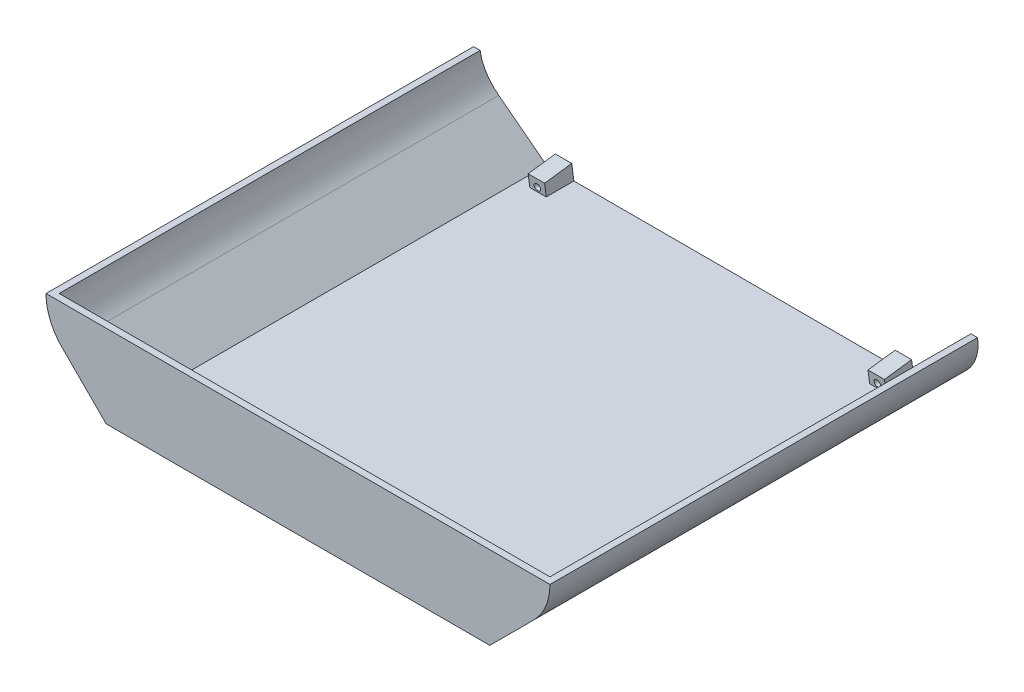
ISO-10303-21;
HEADER;
FILE_DESCRIPTION(('STEP AP214'),'2;1');
FILE_NAME('part.step','',(''),(''),'','','');
FILE_SCHEMA(('AUTOMOTIVE_DESIGN { 1 0 10303 214 1 1 1 1 }'));
ENDSEC;
DATA;
#1=APPLICATION_CONTEXT('core data for automotive mechanical design processes');
#2=APPLICATION_PROTOCOL_DEFINITION('international standard','automotive_design',2000,#1);
#3=PRODUCT_CONTEXT('',#1,'mechanical');
#4=PRODUCT('Part','Part','',(#3));
#5=PRODUCT_RELATED_PRODUCT_CATEGORY('part','',(#4));
#6=PRODUCT_DEFINITION_FORMATION('','',#4);
#7=PRODUCT_DEFINITION_CONTEXT('part definition',#1,'design');
#8=PRODUCT_DEFINITION('design','',#6,#7);
#9=PRODUCT_DEFINITION_SHAPE('','',#8);
#10=(LENGTH_UNIT() NAMED_UNIT(*) SI_UNIT(.MILLI.,.METRE.));
#11=(NAMED_UNIT(*) PLANE_ANGLE_UNIT() SI_UNIT($,.RADIAN.));
#12=(NAMED_UNIT(*) SI_UNIT($,.STERADIAN.) SOLID_ANGLE_UNIT());
#13=UNCERTAINTY_MEASURE_WITH_UNIT(LENGTH_MEASURE(1.E-05),#10,'distance_accuracy_value','');
#14=(GEOMETRIC_REPRESENTATION_CONTEXT(3) GLOBAL_UNCERTAINTY_ASSIGNED_CONTEXT((#13)) GLOBAL_UNIT_ASSIGNED_CONTEXT((#10,
#11,#12)) REPRESENTATION_CONTEXT('',''));
#15=CARTESIAN_POINT('',(0.,0.,0.));
#16=DIRECTION('',(0.,0.,1.));
#17=DIRECTION('',(1.,0.,0.));
#18=AXIS2_PLACEMENT_3D('',#15,#16,#17);
#19=CARTESIAN_POINT('',(-175.,6.,400.));
#20=DIRECTION('',(0.,1.,0.));
#21=DIRECTION('',(-1.,0.,0.));
#22=AXIS2_PLACEMENT_3D('',#19,#20,#21);
#23=PLANE('',#22);
#24=DIRECTION('',(1.,0.,0.));
#25=VECTOR('',#24,1.);
#26=CARTESIAN_POINT('',(0.,6.,0.789914985524294));
#27=LINE('',#26,#25);
#28=CARTESIAN_POINT('',(162.514718625761,6.,0.789914985524294));
#29=VERTEX_POINT('',#28);
#30=CARTESIAN_POINT('',(172.514718625761,6.,0.789914985524294));
#31=VERTEX_POINT('',#30);
#32=EDGE_CURVE('E208',#29,#31,#27,.T.);
#33=ORIENTED_EDGE('',*,*,#32,.F.);
#34=DIRECTION('',(0.,0.,1.));
#35=VECTOR('',#34,1.);
#36=CARTESIAN_POINT('',(162.514718625762,6.,400.));
#37=LINE('',#36,#35);
#38=CARTESIAN_POINT('',(162.514718625761,6.,26.0056390000281));
#39=VERTEX_POINT('',#38);
#40=EDGE_CURVE('E202',#29,#39,#37,.T.);
#41=ORIENTED_EDGE('',*,*,#40,.T.);
#42=DIRECTION('',(1.,0.,0.));
#43=VECTOR('',#42,1.);
#44=CARTESIAN_POINT('',(-175.,6.,26.0056390000281));
#45=LINE('',#44,#43);
#46=CARTESIAN_POINT('',(147.514718625761,6.,26.0056390000281));
#47=VERTEX_POINT('',#46);
#48=EDGE_CURVE('E11',#47,#39,#45,.T.);
#49=ORIENTED_EDGE('',*,*,#48,.F.);
#50=DIRECTION('',(0.,0.,-1.));
#51=VECTOR('',#50,1.);
#52=CARTESIAN_POINT('',(147.514718625761,6.,400.));
#53=LINE('',#52,#51);
#54=CARTESIAN_POINT('',(147.514718625761,6.00000000000006,0.789914985524302));
#55=VERTEX_POINT('',#54);
#56=EDGE_CURVE('E186',#47,#55,#53,.T.);
#57=ORIENTED_EDGE('',*,*,#56,.T.);
#58=CARTESIAN_POINT('',(-147.514718625761,6.,0.789914985524294));
#59=VERTEX_POINT('',#58);
#60=EDGE_CURVE('E199',#59,#55,#27,.T.);
#61=ORIENTED_EDGE('',*,*,#60,.F.);
#62=DIRECTION('',(0.,0.,1.));
#63=VECTOR('',#62,1.);
#64=CARTESIAN_POINT('',(-147.514718625761,6.,400.));
#65=LINE('',#64,#63);
#66=CARTESIAN_POINT('',(-147.514718625761,6.,26.0056390000281));
#67=VERTEX_POINT('',#66);
#68=EDGE_CURVE('E54',#59,#67,#65,.T.);
#69=ORIENTED_EDGE('',*,*,#68,.T.);
#70=DIRECTION('',(-1.,0.,0.));
#71=VECTOR('',#70,1.);
#72=CARTESIAN_POINT('',(-175.,6.,26.0056390000281));
#73=LINE('',#72,#71);
#74=CARTESIAN_POINT('',(-162.514718625761,6.,26.0056390000281));
#75=VERTEX_POINT('',#74);
#76=EDGE_CURVE('E310',#67,#75,#73,.T.);
#77=ORIENTED_EDGE('',*,*,#76,.T.);
#78=DIRECTION('',(0.,0.,-1.));
#79=VECTOR('',#78,1.);
#80=CARTESIAN_POINT('',(-162.514718625762,6.,400.));
#81=LINE('',#80,#79);
#82=CARTESIAN_POINT('',(-162.514718625761,6.,0.789914985524294));
#83=VERTEX_POINT('',#82);
#84=EDGE_CURVE('E314',#75,#83,#81,.T.);
#85=ORIENTED_EDGE('',*,*,#84,.T.);
#86=CARTESIAN_POINT('',(-172.514718625761,6.,0.789914985524294));
#87=VERTEX_POINT('',#86);
#88=EDGE_CURVE('E207',#87,#83,#27,.T.);
#89=ORIENTED_EDGE('',*,*,#88,.F.);
#90=DIRECTION('',(0.,0.,-1.));
#91=VECTOR('',#90,1.);
#92=CARTESIAN_POINT('',(-172.514718625761,6.,400.));
#93=LINE('',#92,#91);
#94=CARTESIAN_POINT('',(-172.514718625761,6.,394.));
#95=VERTEX_POINT('',#94);
#96=EDGE_CURVE('E365',#95,#87,#93,.T.);
#97=ORIENTED_EDGE('',*,*,#96,.F.);
#98=DIRECTION('',(1.,0.,0.));
#99=VECTOR('',#98,1.);
#100=CARTESIAN_POINT('',(-175.,6.,394.));
#101=LINE('',#100,#99);
#102=CARTESIAN_POINT('',(172.514718625761,6.,394.));
#103=VERTEX_POINT('',#102);
#104=EDGE_CURVE('E366',#95,#103,#101,.T.);
#105=ORIENTED_EDGE('',*,*,#104,.T.);
#106=DIRECTION('',(0.,0.,-1.));
#107=VECTOR('',#106,1.);
#108=CARTESIAN_POINT('',(172.514718625761,6.,400.));
#109=LINE('',#108,#107);
#110=EDGE_CURVE('E361',#103,#31,#109,.T.);
#111=ORIENTED_EDGE('',*,*,#110,.T.);
#112=EDGE_LOOP('',(#33,#41,#49,#57,#61,#69,#77,#85,#89,#97,#105,#111));
#113=FACE_BOUND('',#112,.T.);
#114=ADVANCED_FACE('F45',(#113),#23,.T.);
#115=CARTESIAN_POINT('',(175.,0.,400.));
#116=DIRECTION('',(-0.707106781186546,0.707106781186549,0.));
#117=DIRECTION('',(-0.707106781186549,-0.707106781186546,0.));
#118=AXIS2_PLACEMENT_3D('',#115,#116,#117);
#119=PLANE('',#118);
#120=DIRECTION('',(-0.704062592219638,-0.704062592219636,-0.0926915987235618));
#121=VECTOR('',#120,1.);
#122=CARTESIAN_POINT('',(201.104274909717,26.1042749097173,3.43669298957194));
#123=LINE('',#122,#121);
#124=CARTESIAN_POINT('',(215.218833806895,40.2188338068951,5.29490992072962));
#125=VERTEX_POINT('',#124);
#126=CARTESIAN_POINT('',(175.,0.,0.));
#127=VERTEX_POINT('',#126);
#128=EDGE_CURVE('E263',#125,#127,#123,.T.);
#129=ORIENTED_EDGE('',*,*,#128,.F.);
#130=DIRECTION('',(0.,0.,-1.));
#131=VECTOR('',#130,1.);
#132=CARTESIAN_POINT('',(215.218833806895,40.2188338068951,400.));
#133=LINE('',#132,#131);
#134=CARTESIAN_POINT('',(215.218833806895,40.2188338068951,400.));
#135=VERTEX_POINT('',#134);
#136=EDGE_CURVE('E306',#135,#125,#133,.T.);
#137=ORIENTED_EDGE('',*,*,#136,.F.);
#138=DIRECTION('',(0.707106781186549,0.707106781186546,0.));
#139=VECTOR('',#138,1.);
#140=CARTESIAN_POINT('',(175.,0.,400.));
#141=LINE('',#140,#139);
#142=CARTESIAN_POINT('',(175.,0.,400.));
#143=VERTEX_POINT('',#142);
#144=EDGE_CURVE('E267',#143,#135,#141,.T.);
#145=ORIENTED_EDGE('',*,*,#144,.F.);
#146=DIRECTION('',(0.,0.,-1.));
#147=VECTOR('',#146,1.);
#148=CARTESIAN_POINT('',(175.,0.,400.));
#149=LINE('',#148,#147);
#150=EDGE_CURVE('E284',#143,#127,#149,.T.);
#151=ORIENTED_EDGE('',*,*,#150,.T.);
#152=EDGE_LOOP('',(#129,#137,#145,#151));
#153=FACE_BOUND('',#152,.T.);
#154=ADVANCED_FACE('F47',(#153),#119,.F.);
#155=CARTESIAN_POINT('',(179.863494747568,75.5741728662225,400.));
#156=DIRECTION('',(0.,0.,-1.));
#157=DIRECTION('',(-1.,0.,0.));
#158=AXIS2_PLACEMENT_3D('',#155,#156,#157);
#159=CYLINDRICAL_SURFACE('',#158,50.);
#160=CARTESIAN_POINT('',(179.863494747568,75.5741728662225,9.94952861093878));
#161=DIRECTION('',(0.,0.130526192220038,-0.991444861373812));
#162=DIRECTION('',(0.,-0.991444861373812,-0.130526192220038));
#163=AXIS2_PLACEMENT_3D('',#160,#161,#162);
#164=ELLIPSE('',#163,50.4314480290075,50.);
#165=CARTESIAN_POINT('',(229.863494747568,75.5741721608928,9.94952851808034));
#166=VERTEX_POINT('',#165);
#167=EDGE_CURVE('E260',#166,#125,#164,.T.);
#168=ORIENTED_EDGE('',*,*,#167,.F.);
#169=DIRECTION('',(0.,0.,-1.));
#170=VECTOR('',#169,1.);
#171=CARTESIAN_POINT('',(229.863494747568,75.5741720841793,400.));
#172=LINE('',#171,#170);
#173=CARTESIAN_POINT('',(229.863494747568,75.5741720841793,400.));
#174=VERTEX_POINT('',#173);
#175=EDGE_CURVE('E303',#174,#166,#172,.T.);
#176=ORIENTED_EDGE('',*,*,#175,.F.);
#177=CARTESIAN_POINT('',(179.863494747568,75.5741728662225,400.));
#178=DIRECTION('',(0.,0.,1.));
#179=DIRECTION('',(1.,0.,0.));
#180=AXIS2_PLACEMENT_3D('',#177,#178,#179);
#181=CIRCLE('',#180,50.);
#182=EDGE_CURVE('E271',#135,#174,#181,.T.);
#183=ORIENTED_EDGE('',*,*,#182,.F.);
#184=ORIENTED_EDGE('',*,*,#136,.T.);
#185=EDGE_LOOP('',(#168,#176,#183,#184));
#186=FACE_BOUND('',#185,.T.);
#187=ADVANCED_FACE('F427',(#186),#159,.T.);
#188=CARTESIAN_POINT('',(-179.863494747568,75.5741728662222,400.));
#189=DIRECTION('',(0.,0.,-1.));
#190=DIRECTION('',(-1.,0.,0.));
#191=AXIS2_PLACEMENT_3D('',#188,#189,#190);
#192=CYLINDRICAL_SURFACE('',#191,50.);
#193=CARTESIAN_POINT('',(-179.863494747568,75.5741728662222,9.94952861093873));
#194=DIRECTION('',(0.,0.130526192220038,-0.991444861373812));
#195=DIRECTION('',(0.,-0.991444861373812,-0.130526192220038));
#196=AXIS2_PLACEMENT_3D('',#193,#194,#195);
#197=ELLIPSE('',#196,50.4314480290075,50.);
#198=CARTESIAN_POINT('',(-215.218833806895,40.2188338068946,5.29490992072952));
#199=VERTEX_POINT('',#198);
#200=CARTESIAN_POINT('',(-229.863494747568,75.5741721608927,9.94952851808034));
#201=VERTEX_POINT('',#200);
#202=EDGE_CURVE('E256',#199,#201,#197,.T.);
#203=ORIENTED_EDGE('',*,*,#202,.F.);
#204=DIRECTION('',(0.,0.,-1.));
#205=VECTOR('',#204,1.);
#206=CARTESIAN_POINT('',(-215.218833806895,40.2188338068946,400.));
#207=LINE('',#206,#205);
#208=CARTESIAN_POINT('',(-215.218833806895,40.2188338068946,400.));
#209=VERTEX_POINT('',#208);
#210=EDGE_CURVE('E295',#209,#199,#207,.T.);
#211=ORIENTED_EDGE('',*,*,#210,.F.);
#212=CARTESIAN_POINT('',(-179.863494747568,75.5741728662222,400.));
#213=DIRECTION('',(0.,0.,1.));
#214=DIRECTION('',(-1.,0.,0.));
#215=AXIS2_PLACEMENT_3D('',#212,#213,#214);
#216=CIRCLE('',#215,50.);
#217=CARTESIAN_POINT('',(-229.863494747568,75.5741720841793,400.));
#218=VERTEX_POINT('',#217);
#219=EDGE_CURVE('E275',#218,#209,#216,.T.);
#220=ORIENTED_EDGE('',*,*,#219,.F.);
#221=DIRECTION('',(0.,0.,-1.));
#222=VECTOR('',#221,1.);
#223=CARTESIAN_POINT('',(-229.863494747568,75.5741720841793,400.));
#224=LINE('',#223,#222);
#225=EDGE_CURVE('E299',#218,#201,#224,.T.);
#226=ORIENTED_EDGE('',*,*,#225,.T.);
#227=EDGE_LOOP('',(#203,#211,#220,#226));
#228=FACE_BOUND('',#227,.T.);
#229=ADVANCED_FACE('F419',(#228),#192,.T.);
#230=CARTESIAN_POINT('',(-175.,0.,400.));
#231=DIRECTION('',(0.707106781186543,0.707106781186552,0.));
#232=DIRECTION('',(-0.707106781186552,0.707106781186543,0.));
#233=AXIS2_PLACEMENT_3D('',#230,#231,#232);
#234=PLANE('',#233);
#235=DIRECTION('',(-0.704062592219641,0.704062592219633,0.0926915987235614));
#236=VECTOR('',#235,1.);
#237=CARTESIAN_POINT('',(-201.104274909717,26.1042749097171,3.43669298957189));
#238=LINE('',#237,#236);
#239=CARTESIAN_POINT('',(-175.,0.,0.));
#240=VERTEX_POINT('',#239);
#241=EDGE_CURVE('E253',#240,#199,#238,.T.);
#242=ORIENTED_EDGE('',*,*,#241,.F.);
#243=DIRECTION('',(0.,0.,-1.));
#244=VECTOR('',#243,1.);
#245=CARTESIAN_POINT('',(-175.,0.,400.));
#246=LINE('',#245,#244);
#247=CARTESIAN_POINT('',(-175.,0.,400.));
#248=VERTEX_POINT('',#247);
#249=EDGE_CURVE('E291',#248,#240,#246,.T.);
#250=ORIENTED_EDGE('',*,*,#249,.F.);
#251=DIRECTION('',(0.707106781186552,-0.707106781186543,0.));
#252=VECTOR('',#251,1.);
#253=CARTESIAN_POINT('',(-175.,0.,400.));
#254=LINE('',#253,#252);
#255=EDGE_CURVE('E278',#209,#248,#254,.T.);
#256=ORIENTED_EDGE('',*,*,#255,.F.);
#257=ORIENTED_EDGE('',*,*,#210,.T.);
#258=EDGE_LOOP('',(#242,#250,#256,#257));
#259=FACE_BOUND('',#258,.T.);
#260=ADVANCED_FACE('F435',(#259),#234,.F.);
#261=CARTESIAN_POINT('',(-175.,0.,400.));
#262=DIRECTION('',(0.,1.,0.));
#263=DIRECTION('',(-1.,0.,0.));
#264=AXIS2_PLACEMENT_3D('',#261,#262,#263);
#265=PLANE('',#264);
#266=DIRECTION('',(1.,0.,0.));
#267=VECTOR('',#266,1.);
#268=CARTESIAN_POINT('',(-175.,0.,0.));
#269=LINE('',#268,#267);
#270=EDGE_CURVE('E266',#240,#127,#269,.T.);
#271=ORIENTED_EDGE('',*,*,#270,.T.);
#272=ORIENTED_EDGE('',*,*,#150,.F.);
#273=DIRECTION('',(1.,0.,0.));
#274=VECTOR('',#273,1.);
#275=CARTESIAN_POINT('',(-175.,0.,400.));
#276=LINE('',#275,#274);
#277=EDGE_CURVE('E281',#248,#143,#276,.T.);
#278=ORIENTED_EDGE('',*,*,#277,.F.);
#279=ORIENTED_EDGE('',*,*,#249,.T.);
#280=EDGE_LOOP('',(#271,#272,#278,#279));
#281=FACE_BOUND('',#280,.T.);
#282=ADVANCED_FACE('F433',(#281),#265,.F.);
#283=CARTESIAN_POINT('',(179.863494747568,75.5741728662225,400.));
#284=DIRECTION('',(0.,0.,1.));
#285=DIRECTION('',(1.,0.,0.));
#286=AXIS2_PLACEMENT_3D('',#283,#284,#285);
#287=PLANE('',#286);
#288=DIRECTION('',(1.,0.,0.));
#289=VECTOR('',#288,1.);
#290=CARTESIAN_POINT('',(-310.,75.5741720841793,400.));
#291=LINE('',#290,#289);
#292=EDGE_CURVE('E250',#218,#174,#291,.T.);
#293=ORIENTED_EDGE('',*,*,#292,.F.);
#294=ORIENTED_EDGE('',*,*,#219,.T.);
#295=ORIENTED_EDGE('',*,*,#255,.T.);
#296=ORIENTED_EDGE('',*,*,#277,.T.);
#297=ORIENTED_EDGE('',*,*,#144,.T.);
#298=ORIENTED_EDGE('',*,*,#182,.T.);
#299=EDGE_LOOP('',(#293,#294,#295,#296,#297,#298));
#300=FACE_BOUND('',#299,.T.);
#301=ADVANCED_FACE('F422',(#300),#287,.T.);
#302=CARTESIAN_POINT('',(0.,0.,0.));
#303=DIRECTION('',(0.,0.130526192220038,-0.991444861373812));
#304=DIRECTION('',(0.,0.991444861373812,0.130526192220038));
#305=AXIS2_PLACEMENT_3D('',#302,#303,#304);
#306=PLANE('',#305);
#307=CARTESIAN_POINT('',(155.014718625761,13.4358364603037,1.76886142717459));
#308=DIRECTION('',(0.,0.130526192220038,-0.991444861373812));
#309=DIRECTION('',(0.,0.991444861373812,0.130526192220038));
#310=AXIS2_PLACEMENT_3D('',#307,#308,#309);
#311=CIRCLE('',#310,2.99999999999999);
#312=CARTESIAN_POINT('',(155.014718625761,16.4101710444251,2.16044000383471));
#313=VERTEX_POINT('',#312);
#314=EDGE_CURVE('E705',#313,#313,#311,.T.);
#315=ORIENTED_EDGE('',*,*,#314,.F.);
#316=EDGE_LOOP('',(#315));
#317=FACE_BOUND('',#316,.T.);
#318=CARTESIAN_POINT('',(-155.014718625761,13.4358364603036,1.76886142717459));
#319=DIRECTION('',(0.,0.130526192220038,-0.991444861373812));
#320=DIRECTION('',(0.,-0.991444861373812,-0.130526192220038));
#321=AXIS2_PLACEMENT_3D('',#318,#319,#320);
#322=CIRCLE('',#321,2.99999999999999);
#323=CARTESIAN_POINT('',(-155.014718625761,10.4615018761822,1.37728285051447));
#324=VERTEX_POINT('',#323);
#325=EDGE_CURVE('E700',#324,#324,#322,.T.);
#326=ORIENTED_EDGE('',*,*,#325,.F.);
#327=EDGE_LOOP('',(#326));
#328=FACE_BOUND('',#327,.T.);
#329=DIRECTION('',(-1.,0.,0.));
#330=VECTOR('',#329,1.);
#331=CARTESIAN_POINT('',(0.,75.5741721608927,9.94952851808035));
#332=LINE('',#331,#330);
#333=CARTESIAN_POINT('',(223.863494747568,75.5741721608927,9.94952851808037));
#334=VERTEX_POINT('',#333);
#335=EDGE_CURVE('E232',#166,#334,#332,.T.);
#336=ORIENTED_EDGE('',*,*,#335,.F.);
#337=ORIENTED_EDGE('',*,*,#167,.T.);
#338=ORIENTED_EDGE('',*,*,#128,.T.);
#339=ORIENTED_EDGE('',*,*,#270,.F.);
#340=ORIENTED_EDGE('',*,*,#241,.T.);
#341=ORIENTED_EDGE('',*,*,#202,.T.);
#342=CARTESIAN_POINT('',(-223.863494747568,75.5741721608927,9.94952851808034));
#343=VERTEX_POINT('',#342);
#344=EDGE_CURVE('E352',#343,#201,#332,.T.);
#345=ORIENTED_EDGE('',*,*,#344,.F.);
#346=CARTESIAN_POINT('',(-179.863494747568,75.5741728662222,9.94952861093873));
#347=DIRECTION('',(0.,0.130526192220038,-0.991444861373812));
#348=DIRECTION('',(0.,-0.991444861373812,-0.130526192220038));
#349=AXIS2_PLACEMENT_3D('',#346,#347,#348);
#350=ELLIPSE('',#349,44.3796742655266,44.);
#351=CARTESIAN_POINT('',(-210.976193119776,44.4614744940139,5.85346416355459));
#352=VERTEX_POINT('',#351);
#353=EDGE_CURVE('E221',#352,#343,#350,.T.);
#354=ORIENTED_EDGE('',*,*,#353,.F.);
#355=DIRECTION('',(-0.704062592219641,0.704062592219633,0.0926915987235614));
#356=VECTOR('',#355,1.);
#357=CARTESIAN_POINT('',(-196.825182588831,30.3104639630696,3.99044828377049));
#358=LINE('',#357,#356);
#359=EDGE_CURVE('E218',#87,#352,#358,.T.);
#360=ORIENTED_EDGE('',*,*,#359,.F.);
#361=ORIENTED_EDGE('',*,*,#88,.T.);
#362=DIRECTION('',(0.,-0.991444861373812,-0.130526192220038));
#363=VECTOR('',#362,1.);
#364=CARTESIAN_POINT('',(-162.514718625761,6.,0.789914985524294));
#365=LINE('',#364,#363);
#366=CARTESIAN_POINT('',(-162.514718625761,20.8716729206072,2.74780786882487));
#367=VERTEX_POINT('',#366);
#368=EDGE_CURVE('E329',#367,#83,#365,.T.);
#369=ORIENTED_EDGE('',*,*,#368,.F.);
#370=DIRECTION('',(-1.,0.,0.));
#371=VECTOR('',#370,1.);
#372=CARTESIAN_POINT('',(-162.514718625761,20.8716729206072,2.74780786882487));
#373=LINE('',#372,#371);
#374=CARTESIAN_POINT('',(-147.514718625761,20.8716729206072,2.74780786882487));
#375=VERTEX_POINT('',#374);
#376=EDGE_CURVE('E335',#375,#367,#373,.T.);
#377=ORIENTED_EDGE('',*,*,#376,.F.);
#378=DIRECTION('',(0.,0.991444861373812,0.130526192220038));
#379=VECTOR('',#378,1.);
#380=CARTESIAN_POINT('',(-147.514718625761,20.8716729206072,2.74780786882487));
#381=LINE('',#380,#379);
#382=EDGE_CURVE('E68',#59,#375,#381,.T.);
#383=ORIENTED_EDGE('',*,*,#382,.F.);
#384=ORIENTED_EDGE('',*,*,#60,.T.);
#385=DIRECTION('',(0.,-0.991444861373812,-0.130526192220038));
#386=VECTOR('',#385,1.);
#387=CARTESIAN_POINT('',(147.514718625761,20.8716729206072,2.74780786882488));
#388=LINE('',#387,#386);
#389=CARTESIAN_POINT('',(147.514718625761,20.8716729206072,2.74780786882488));
#390=VERTEX_POINT('',#389);
#391=EDGE_CURVE('E182',#390,#55,#388,.T.);
#392=ORIENTED_EDGE('',*,*,#391,.F.);
#393=DIRECTION('',(-1.,0.,0.));
#394=VECTOR('',#393,1.);
#395=CARTESIAN_POINT('',(162.514718625762,20.8716729206072,2.74780786882488));
#396=LINE('',#395,#394);
#397=CARTESIAN_POINT('',(162.514718625762,20.8716729206072,2.74780786882488));
#398=VERTEX_POINT('',#397);
#399=EDGE_CURVE('E191',#398,#390,#396,.T.);
#400=ORIENTED_EDGE('',*,*,#399,.F.);
#401=DIRECTION('',(0.,0.991444861373812,0.130526192220038));
#402=VECTOR('',#401,1.);
#403=CARTESIAN_POINT('',(162.514718625761,6.00000000000005,0.789914985524301));
#404=LINE('',#403,#402);
#405=EDGE_CURVE('E61',#29,#398,#404,.T.);
#406=ORIENTED_EDGE('',*,*,#405,.F.);
#407=ORIENTED_EDGE('',*,*,#32,.T.);
#408=DIRECTION('',(-0.704062592219638,-0.704062592219636,-0.0926915987235618));
#409=VECTOR('',#408,1.);
#410=CARTESIAN_POINT('',(196.825182588831,30.3104639630699,3.99044828377049));
#411=LINE('',#410,#409);
#412=CARTESIAN_POINT('',(210.976193119776,44.4614744940144,5.85346416355464));
#413=VERTEX_POINT('',#412);
#414=EDGE_CURVE('E214',#413,#31,#411,.T.);
#415=ORIENTED_EDGE('',*,*,#414,.F.);
#416=CARTESIAN_POINT('',(179.863494747568,75.5741728662225,9.94952861093878));
#417=DIRECTION('',(0.,0.130526192220038,-0.991444861373812));
#418=DIRECTION('',(0.,-0.991444861373812,-0.130526192220038));
#419=AXIS2_PLACEMENT_3D('',#416,#417,#418);
#420=ELLIPSE('',#419,44.3796742655266,44.);
#421=EDGE_CURVE('E226',#334,#413,#420,.T.);
#422=ORIENTED_EDGE('',*,*,#421,.F.);
#423=EDGE_LOOP('',(#336,#337,#338,#339,#340,#341,#345,#354,#360,#361,#369,#377,#383,#384,#392,
#400,#406,#407,#415,#422));
#424=FACE_BOUND('',#423,.T.);
#425=ADVANCED_FACE('F205',(#317,#328,#424),#306,.T.);
#426=CARTESIAN_POINT('',(170.757359312881,4.24264068711929,400.));
#427=DIRECTION('',(-0.707106781186546,0.707106781186549,0.));
#428=DIRECTION('',(-0.707106781186549,-0.707106781186546,0.));
#429=AXIS2_PLACEMENT_3D('',#426,#427,#428);
#430=PLANE('',#429);
#431=ORIENTED_EDGE('',*,*,#414,.T.);
#432=ORIENTED_EDGE('',*,*,#110,.F.);
#433=DIRECTION('',(0.707106781186549,0.707106781186546,0.));
#434=VECTOR('',#433,1.);
#435=CARTESIAN_POINT('',(170.757359312881,4.24264068711929,394.));
#436=LINE('',#435,#434);
#437=CARTESIAN_POINT('',(210.976193119776,44.4614744940144,394.));
#438=VERTEX_POINT('',#437);
#439=EDGE_CURVE('E213',#103,#438,#436,.T.);
#440=ORIENTED_EDGE('',*,*,#439,.T.);
#441=DIRECTION('',(0.,0.,-1.));
#442=VECTOR('',#441,1.);
#443=CARTESIAN_POINT('',(210.976193119776,44.4614744940144,400.));
#444=LINE('',#443,#442);
#445=EDGE_CURVE('E246',#438,#413,#444,.T.);
#446=ORIENTED_EDGE('',*,*,#445,.T.);
#447=EDGE_LOOP('',(#431,#432,#440,#446));
#448=FACE_BOUND('',#447,.T.);
#449=ADVANCED_FACE('F401',(#448),#430,.T.);
#450=CARTESIAN_POINT('',(179.863494747568,75.5741728662225,400.));
#451=DIRECTION('',(0.,0.,-1.));
#452=DIRECTION('',(-1.,0.,0.));
#453=AXIS2_PLACEMENT_3D('',#450,#451,#452);
#454=CYLINDRICAL_SURFACE('',#453,44.);
#455=ORIENTED_EDGE('',*,*,#421,.T.);
#456=ORIENTED_EDGE('',*,*,#445,.F.);
#457=CARTESIAN_POINT('',(179.863494747568,75.5741728662225,394.));
#458=DIRECTION('',(0.,0.,1.));
#459=DIRECTION('',(1.,0.,0.));
#460=AXIS2_PLACEMENT_3D('',#457,#458,#459);
#461=CIRCLE('',#460,44.);
#462=CARTESIAN_POINT('',(223.863494747568,75.5741721612645,394.));
#463=VERTEX_POINT('',#462);
#464=EDGE_CURVE('E235',#438,#463,#461,.T.);
#465=ORIENTED_EDGE('',*,*,#464,.T.);
#466=DIRECTION('',(0.,0.,-1.));
#467=VECTOR('',#466,1.);
#468=CARTESIAN_POINT('',(223.863494747568,75.5741721780245,400.));
#469=LINE('',#468,#467);
#470=EDGE_CURVE('E242',#463,#334,#469,.T.);
#471=ORIENTED_EDGE('',*,*,#470,.T.);
#472=EDGE_LOOP('',(#455,#456,#465,#471));
#473=FACE_BOUND('',#472,.T.);
#474=ADVANCED_FACE('F412',(#473),#454,.F.);
#475=CARTESIAN_POINT('',(-179.863494747568,75.5741728662222,400.));
#476=DIRECTION('',(0.,0.,-1.));
#477=DIRECTION('',(-1.,0.,0.));
#478=AXIS2_PLACEMENT_3D('',#475,#476,#477);
#479=CYLINDRICAL_SURFACE('',#478,44.);
#480=ORIENTED_EDGE('',*,*,#353,.T.);
#481=DIRECTION('',(0.,0.,-1.));
#482=VECTOR('',#481,1.);
#483=CARTESIAN_POINT('',(-223.863494747568,75.5741721780245,400.));
#484=LINE('',#483,#482);
#485=CARTESIAN_POINT('',(-223.863494747568,75.5741720841793,394.));
#486=VERTEX_POINT('',#485);
#487=EDGE_CURVE('E247',#486,#343,#484,.T.);
#488=ORIENTED_EDGE('',*,*,#487,.F.);
#489=CARTESIAN_POINT('',(-179.863494747568,75.5741728662222,394.));
#490=DIRECTION('',(0.,0.,1.));
#491=DIRECTION('',(1.,0.,0.));
#492=AXIS2_PLACEMENT_3D('',#489,#490,#491);
#493=CIRCLE('',#492,44.);
#494=CARTESIAN_POINT('',(-210.976193119776,44.4614744940139,394.));
#495=VERTEX_POINT('',#494);
#496=EDGE_CURVE('E239',#486,#495,#493,.T.);
#497=ORIENTED_EDGE('',*,*,#496,.T.);
#498=DIRECTION('',(0.,0.,1.));
#499=VECTOR('',#498,1.);
#500=CARTESIAN_POINT('',(-210.976193119776,44.4614744940139,400.));
#501=LINE('',#500,#499);
#502=EDGE_CURVE('E376',#495,#352,#501,.F.);
#503=ORIENTED_EDGE('',*,*,#502,.T.);
#504=EDGE_LOOP('',(#480,#488,#497,#503));
#505=FACE_BOUND('',#504,.T.);
#506=ADVANCED_FACE('F393',(#505),#479,.F.);
#507=CARTESIAN_POINT('',(-170.757359312881,4.24264068711931,400.));
#508=DIRECTION('',(0.707106781186543,0.707106781186552,0.));
#509=DIRECTION('',(-0.707106781186552,0.707106781186543,0.));
#510=AXIS2_PLACEMENT_3D('',#507,#508,#509);
#511=PLANE('',#510);
#512=ORIENTED_EDGE('',*,*,#359,.T.);
#513=ORIENTED_EDGE('',*,*,#502,.F.);
#514=DIRECTION('',(0.707106781186552,-0.707106781186543,0.));
#515=VECTOR('',#514,1.);
#516=CARTESIAN_POINT('',(-170.757359312881,4.24264068711931,394.));
#517=LINE('',#516,#515);
#518=EDGE_CURVE('E369',#495,#95,#517,.T.);
#519=ORIENTED_EDGE('',*,*,#518,.T.);
#520=ORIENTED_EDGE('',*,*,#96,.T.);
#521=EDGE_LOOP('',(#512,#513,#519,#520));
#522=FACE_BOUND('',#521,.T.);
#523=ADVANCED_FACE('F384',(#522),#511,.T.);
#524=CARTESIAN_POINT('',(179.863494747568,75.5741728662225,394.));
#525=DIRECTION('',(0.,0.,1.));
#526=DIRECTION('',(1.,0.,0.));
#527=AXIS2_PLACEMENT_3D('',#524,#525,#526);
#528=PLANE('',#527);
#529=DIRECTION('',(1.,0.,0.));
#530=VECTOR('',#529,1.);
#531=CARTESIAN_POINT('',(-310.,75.5741720841793,394.));
#532=LINE('',#531,#530);
#533=EDGE_CURVE('E222',#486,#463,#532,.T.);
#534=ORIENTED_EDGE('',*,*,#533,.T.);
#535=ORIENTED_EDGE('',*,*,#464,.F.);
#536=ORIENTED_EDGE('',*,*,#439,.F.);
#537=ORIENTED_EDGE('',*,*,#104,.F.);
#538=ORIENTED_EDGE('',*,*,#518,.F.);
#539=ORIENTED_EDGE('',*,*,#496,.F.);
#540=EDGE_LOOP('',(#534,#535,#536,#537,#538,#539));
#541=FACE_BOUND('',#540,.T.);
#542=ADVANCED_FACE('F396',(#541),#528,.F.);
#543=CARTESIAN_POINT('',(-239.863494747568,75.5741721608927,-1.2E-05));
#544=DIRECTION('',(0.,-1.,0.));
#545=DIRECTION('',(0.,0.,-1.));
#546=AXIS2_PLACEMENT_3D('',#543,#544,#545);
#547=PLANE('',#546);
#548=ORIENTED_EDGE('',*,*,#335,.T.);
#549=ORIENTED_EDGE('',*,*,#470,.F.);
#550=ORIENTED_EDGE('',*,*,#533,.F.);
#551=ORIENTED_EDGE('',*,*,#487,.T.);
#552=ORIENTED_EDGE('',*,*,#344,.T.);
#553=ORIENTED_EDGE('',*,*,#225,.F.);
#554=ORIENTED_EDGE('',*,*,#292,.T.);
#555=ORIENTED_EDGE('',*,*,#175,.T.);
#556=EDGE_LOOP('',(#548,#549,#550,#551,#552,#553,#554,#555));
#557=FACE_BOUND('',#556,.T.);
#558=ADVANCED_FACE('F408',(#557),#547,.F.);
#559=CARTESIAN_POINT('',(-147.514718625761,17.6085181151062,27.5339294031702));
#560=DIRECTION('',(-1.,0.,0.));
#561=DIRECTION('',(0.,0.,1.));
#562=AXIS2_PLACEMENT_3D('',#559,#560,#561);
#563=PLANE('',#562);
#564=ORIENTED_EDGE('',*,*,#68,.F.);
#565=ORIENTED_EDGE('',*,*,#382,.T.);
#566=DIRECTION('',(0.,0.130526192220038,-0.991444861373812));
#567=VECTOR('',#566,1.);
#568=CARTESIAN_POINT('',(-147.514718625761,17.6085181151062,27.5339294031702));
#569=LINE('',#568,#567);
#570=CARTESIAN_POINT('',(-147.514718625761,17.6085181151062,27.5339294031702));
#571=VERTEX_POINT('',#570);
#572=EDGE_CURVE('E324',#571,#375,#569,.T.);
#573=ORIENTED_EDGE('',*,*,#572,.F.);
#574=DIRECTION('',(0.,0.991444861373812,0.130526192220038));
#575=VECTOR('',#574,1.);
#576=CARTESIAN_POINT('',(-147.514718625761,17.6085181151062,27.5339294031702));
#577=LINE('',#576,#575);
#578=EDGE_CURVE('E323',#67,#571,#577,.T.);
#579=ORIENTED_EDGE('',*,*,#578,.F.);
#580=EDGE_LOOP('',(#564,#565,#573,#579));
#581=FACE_BOUND('',#580,.T.);
#582=ADVANCED_FACE('F320',(#581),#563,.F.);
#583=CARTESIAN_POINT('',(-162.514718625761,17.6085181151062,27.5339294031702));
#584=DIRECTION('',(0.,-0.991444861373812,-0.130526192220038));
#585=DIRECTION('',(0.,0.130526192220038,-0.991444861373812));
#586=AXIS2_PLACEMENT_3D('',#583,#584,#585);
#587=PLANE('',#586);
#588=ORIENTED_EDGE('',*,*,#376,.T.);
#589=DIRECTION('',(0.,0.130526192220038,-0.991444861373812));
#590=VECTOR('',#589,1.);
#591=CARTESIAN_POINT('',(-162.514718625761,17.6085181151062,27.5339294031702));
#592=LINE('',#591,#590);
#593=CARTESIAN_POINT('',(-162.514718625761,17.6085181151062,27.5339294031702));
#594=VERTEX_POINT('',#593);
#595=EDGE_CURVE('E342',#594,#367,#592,.T.);
#596=ORIENTED_EDGE('',*,*,#595,.F.);
#597=DIRECTION('',(-1.,0.,0.));
#598=VECTOR('',#597,1.);
#599=CARTESIAN_POINT('',(-162.514718625761,17.6085181151062,27.5339294031702));
#600=LINE('',#599,#598);
#601=EDGE_CURVE('E328',#571,#594,#600,.T.);
#602=ORIENTED_EDGE('',*,*,#601,.F.);
#603=ORIENTED_EDGE('',*,*,#572,.T.);
#604=EDGE_LOOP('',(#588,#596,#602,#603));
#605=FACE_BOUND('',#604,.T.);
#606=ADVANCED_FACE('F514',(#605),#587,.F.);
#607=CARTESIAN_POINT('',(-162.514718625761,2.73684519449904,25.5760365198696));
#608=DIRECTION('',(1.,0.,0.));
#609=DIRECTION('',(0.,1.,0.));
#610=AXIS2_PLACEMENT_3D('',#607,#608,#609);
#611=PLANE('',#610);
#612=ORIENTED_EDGE('',*,*,#84,.F.);
#613=DIRECTION('',(0.,-0.991444861373812,-0.130526192220038));
#614=VECTOR('',#613,1.);
#615=CARTESIAN_POINT('',(-162.514718625761,2.73684519449904,25.5760365198696));
#616=LINE('',#615,#614);
#617=EDGE_CURVE('E333',#594,#75,#616,.T.);
#618=ORIENTED_EDGE('',*,*,#617,.F.);
#619=ORIENTED_EDGE('',*,*,#595,.T.);
#620=ORIENTED_EDGE('',*,*,#368,.T.);
#621=EDGE_LOOP('',(#612,#618,#619,#620));
#622=FACE_BOUND('',#621,.T.);
#623=ADVANCED_FACE('F521',(#622),#611,.F.);
#624=CARTESIAN_POINT('',(0.,-3.26315480550096,24.7861215343453));
#625=DIRECTION('',(0.,0.130526192220038,-0.991444861373812));
#626=DIRECTION('',(0.,0.991444861373812,0.130526192220038));
#627=AXIS2_PLACEMENT_3D('',#624,#625,#626);
#628=PLANE('',#627);
#629=CARTESIAN_POINT('',(-155.014718625761,10.1726816548027,26.5549829615199));
#630=DIRECTION('',(0.,0.130526192220038,-0.991444861373812));
#631=DIRECTION('',(0.,0.991444861373812,0.130526192220038));
#632=AXIS2_PLACEMENT_3D('',#629,#630,#631);
#633=CIRCLE('',#632,2.99999999999999);
#634=CARTESIAN_POINT('',(-155.014718625761,13.1470162389241,26.94656153818));
#635=VERTEX_POINT('',#634);
#636=EDGE_CURVE('E703',#635,#635,#633,.F.);
#637=ORIENTED_EDGE('',*,*,#636,.F.);
#638=EDGE_LOOP('',(#637));
#639=FACE_BOUND('',#638,.T.);
#640=ORIENTED_EDGE('',*,*,#76,.F.);
#641=ORIENTED_EDGE('',*,*,#578,.T.);
#642=ORIENTED_EDGE('',*,*,#601,.T.);
#643=ORIENTED_EDGE('',*,*,#617,.T.);
#644=EDGE_LOOP('',(#640,#641,#642,#643));
#645=FACE_BOUND('',#644,.T.);
#646=ADVANCED_FACE('F529',(#639,#645),#628,.F.);
#647=CARTESIAN_POINT('',(162.514718625761,2.73684519449909,25.5760365198696));
#648=DIRECTION('',(-1.,0.,0.));
#649=DIRECTION('',(0.,-1.,0.));
#650=AXIS2_PLACEMENT_3D('',#647,#648,#649);
#651=PLANE('',#650);
#652=ORIENTED_EDGE('',*,*,#40,.F.);
#653=ORIENTED_EDGE('',*,*,#405,.T.);
#654=DIRECTION('',(0.,0.130526192220038,-0.991444861373812));
#655=VECTOR('',#654,1.);
#656=CARTESIAN_POINT('',(162.514718625762,17.6085181151063,27.5339294031702));
#657=LINE('',#656,#655);
#658=CARTESIAN_POINT('',(162.514718625762,17.6085181151063,27.5339294031702));
#659=VERTEX_POINT('',#658);
#660=EDGE_CURVE('E714',#659,#398,#657,.T.);
#661=ORIENTED_EDGE('',*,*,#660,.F.);
#662=DIRECTION('',(0.,0.991444861373812,0.130526192220038));
#663=VECTOR('',#662,1.);
#664=CARTESIAN_POINT('',(162.514718625761,2.73684519449909,25.5760365198696));
#665=LINE('',#664,#663);
#666=EDGE_CURVE('E192',#39,#659,#665,.T.);
#667=ORIENTED_EDGE('',*,*,#666,.F.);
#668=EDGE_LOOP('',(#652,#653,#661,#667));
#669=FACE_BOUND('',#668,.T.);
#670=ADVANCED_FACE('F537',(#669),#651,.F.);
#671=CARTESIAN_POINT('',(162.514718625762,17.6085181151063,27.5339294031702));
#672=DIRECTION('',(0.,-0.991444861373812,-0.130526192220038));
#673=DIRECTION('',(0.,0.130526192220038,-0.991444861373812));
#674=AXIS2_PLACEMENT_3D('',#671,#672,#673);
#675=PLANE('',#674);
#676=ORIENTED_EDGE('',*,*,#399,.T.);
#677=DIRECTION('',(0.,0.130526192220038,-0.991444861373812));
#678=VECTOR('',#677,1.);
#679=CARTESIAN_POINT('',(147.514718625761,17.6085181151063,27.5339294031702));
#680=LINE('',#679,#678);
#681=CARTESIAN_POINT('',(147.514718625761,17.6085181151063,27.5339294031702));
#682=VERTEX_POINT('',#681);
#683=EDGE_CURVE('E189',#682,#390,#680,.T.);
#684=ORIENTED_EDGE('',*,*,#683,.F.);
#685=DIRECTION('',(-1.,0.,0.));
#686=VECTOR('',#685,1.);
#687=CARTESIAN_POINT('',(162.514718625762,17.6085181151063,27.5339294031702));
#688=LINE('',#687,#686);
#689=EDGE_CURVE('E727',#659,#682,#688,.T.);
#690=ORIENTED_EDGE('',*,*,#689,.F.);
#691=ORIENTED_EDGE('',*,*,#660,.T.);
#692=EDGE_LOOP('',(#676,#684,#690,#691));
#693=FACE_BOUND('',#692,.T.);
#694=ADVANCED_FACE('F545',(#693),#675,.F.);
#695=CARTESIAN_POINT('',(147.514718625761,17.6085181151063,27.5339294031702));
#696=DIRECTION('',(1.,0.,0.));
#697=DIRECTION('',(0.,0.,-1.));
#698=AXIS2_PLACEMENT_3D('',#695,#696,#697);
#699=PLANE('',#698);
#700=ORIENTED_EDGE('',*,*,#56,.F.);
#701=DIRECTION('',(0.,-0.991444861373812,-0.130526192220038));
#702=VECTOR('',#701,1.);
#703=CARTESIAN_POINT('',(147.514718625761,17.6085181151063,27.5339294031702));
#704=LINE('',#703,#702);
#705=EDGE_CURVE('E719',#682,#47,#704,.T.);
#706=ORIENTED_EDGE('',*,*,#705,.F.);
#707=ORIENTED_EDGE('',*,*,#683,.T.);
#708=ORIENTED_EDGE('',*,*,#391,.T.);
#709=EDGE_LOOP('',(#700,#706,#707,#708));
#710=FACE_BOUND('',#709,.T.);
#711=ADVANCED_FACE('F184',(#710),#699,.F.);
#712=CARTESIAN_POINT('',(0.,-3.26315480550096,24.7861215343453));
#713=DIRECTION('',(0.,-0.130526192220038,0.991444861373812));
#714=DIRECTION('',(0.,-0.991444861373812,-0.130526192220038));
#715=AXIS2_PLACEMENT_3D('',#712,#713,#714);
#716=PLANE('',#715);
#717=CARTESIAN_POINT('',(155.014718625761,10.1726816548027,26.5549829615199));
#718=DIRECTION('',(0.,-0.130526192220038,0.991444861373812));
#719=DIRECTION('',(0.,-0.991444861373812,-0.130526192220038));
#720=AXIS2_PLACEMENT_3D('',#717,#718,#719);
#721=CIRCLE('',#720,2.99999999999999);
#722=CARTESIAN_POINT('',(155.014718625761,7.19834707068127,26.1634043848598));
#723=VERTEX_POINT('',#722);
#724=EDGE_CURVE('E710',#723,#723,#721,.F.);
#725=ORIENTED_EDGE('',*,*,#724,.T.);
#726=EDGE_LOOP('',(#725));
#727=FACE_BOUND('',#726,.T.);
#728=ORIENTED_EDGE('',*,*,#705,.T.);
#729=ORIENTED_EDGE('',*,*,#48,.T.);
#730=ORIENTED_EDGE('',*,*,#666,.T.);
#731=ORIENTED_EDGE('',*,*,#689,.T.);
#732=EDGE_LOOP('',(#728,#729,#730,#731));
#733=FACE_BOUND('',#732,.T.);
#734=ADVANCED_FACE('F559',(#727,#733),#716,.T.);
#735=CARTESIAN_POINT('',(155.014718625761,-38.3281190068048,394.955139057425));
#736=DIRECTION('',(0.,0.130526192220039,-0.991444861373812));
#737=DIRECTION('',(0.,0.991444861373812,0.130526192220039));
#738=AXIS2_PLACEMENT_3D('',#735,#736,#737);
#739=CYLINDRICAL_SURFACE('',#738,2.99999999999999);
#740=ORIENTED_EDGE('',*,*,#724,.F.);
#741=EDGE_LOOP('',(#740));
#742=FACE_BOUND('',#741,.T.);
#743=ORIENTED_EDGE('',*,*,#314,.T.);
#744=EDGE_LOOP('',(#743));
#745=FACE_BOUND('',#744,.T.);
#746=ADVANCED_FACE('F565',(#742,#745),#739,.F.);
#747=CARTESIAN_POINT('',(-155.014718625761,-38.3281190068048,394.955139057425));
#748=DIRECTION('',(0.,0.130526192220039,-0.991444861373812));
#749=DIRECTION('',(0.,0.991444861373812,0.130526192220039));
#750=AXIS2_PLACEMENT_3D('',#747,#748,#749);
#751=CYLINDRICAL_SURFACE('',#750,2.99999999999999);
#752=ORIENTED_EDGE('',*,*,#325,.T.);
#753=EDGE_LOOP('',(#752));
#754=FACE_BOUND('',#753,.T.);
#755=ORIENTED_EDGE('',*,*,#636,.T.);
#756=EDGE_LOOP('',(#755));
#757=FACE_BOUND('',#756,.T.);
#758=ADVANCED_FACE('F573',(#754,#757),#751,.F.);
#759=CLOSED_SHELL('',(#114,#154,#187,#229,#260,#282,#301,#425,#449,#474,#506,#523,#542,#558,
#582,#606,#623,#646,#670,#694,#711,#734,#746,#758));
#760=MANIFOLD_SOLID_BREP('B2',#759);
#761=ADVANCED_BREP_SHAPE_REPRESENTATION('',(#18,#760),#14);
#762=SHAPE_DEFINITION_REPRESENTATION(#9,#761);
ENDSEC;
END-ISO-10303-21;
